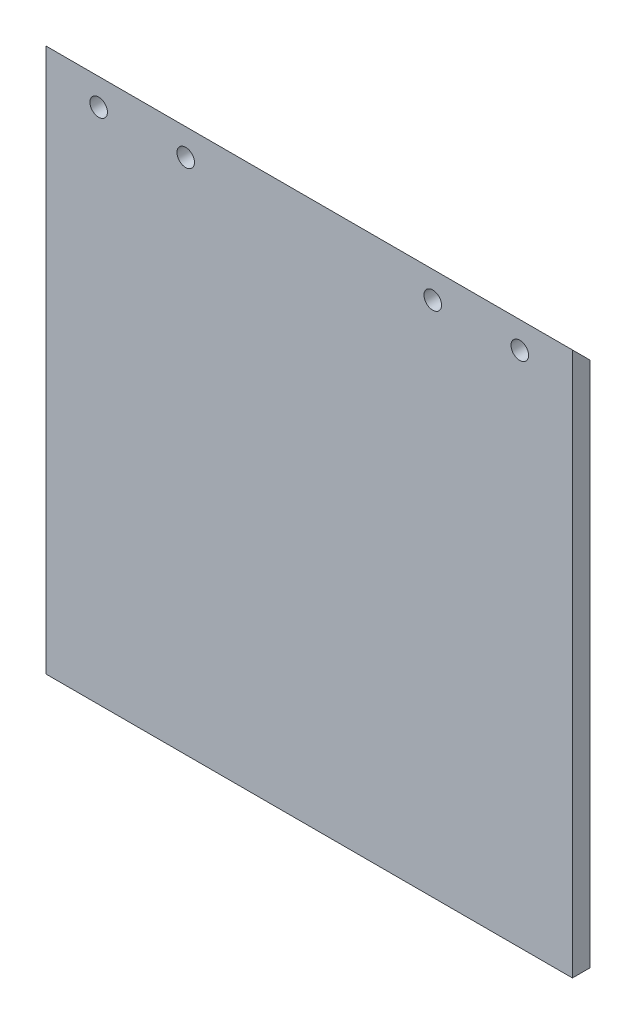
ISO-10303-21;
HEADER;
FILE_DESCRIPTION(('STEP AP214'),'2;1');
FILE_NAME('part.step','',(''),(''),'','','');
FILE_SCHEMA(('AUTOMOTIVE_DESIGN { 1 0 10303 214 1 1 1 1 }'));
ENDSEC;
DATA;
#1=APPLICATION_CONTEXT('core data for automotive mechanical design processes');
#2=APPLICATION_PROTOCOL_DEFINITION('international standard','automotive_design',2000,#1);
#3=PRODUCT_CONTEXT('',#1,'mechanical');
#4=PRODUCT('Part','Part','',(#3));
#5=PRODUCT_RELATED_PRODUCT_CATEGORY('part','',(#4));
#6=PRODUCT_DEFINITION_FORMATION('','',#4);
#7=PRODUCT_DEFINITION_CONTEXT('part definition',#1,'design');
#8=PRODUCT_DEFINITION('design','',#6,#7);
#9=PRODUCT_DEFINITION_SHAPE('','',#8);
#10=(LENGTH_UNIT() NAMED_UNIT(*) SI_UNIT(.MILLI.,.METRE.));
#11=(NAMED_UNIT(*) PLANE_ANGLE_UNIT() SI_UNIT($,.RADIAN.));
#12=(NAMED_UNIT(*) SI_UNIT($,.STERADIAN.) SOLID_ANGLE_UNIT());
#13=UNCERTAINTY_MEASURE_WITH_UNIT(LENGTH_MEASURE(1.E-05),#10,'distance_accuracy_value','');
#14=(GEOMETRIC_REPRESENTATION_CONTEXT(3) GLOBAL_UNCERTAINTY_ASSIGNED_CONTEXT((#13)) GLOBAL_UNIT_ASSIGNED_CONTEXT((#10,
#11,#12)) REPRESENTATION_CONTEXT('',''));
#15=CARTESIAN_POINT('',(0.,0.,0.));
#16=DIRECTION('',(0.,0.,1.));
#17=DIRECTION('',(1.,0.,0.));
#18=AXIS2_PLACEMENT_3D('',#15,#16,#17);
#19=CARTESIAN_POINT('',(0.,0.,3.175));
#20=DIRECTION('',(0.,-1.,0.));
#21=DIRECTION('',(0.,0.,-1.));
#22=AXIS2_PLACEMENT_3D('',#19,#20,#21);
#23=PLANE('',#22);
#24=DIRECTION('',(-1.,0.,0.));
#25=VECTOR('',#24,1.);
#26=CARTESIAN_POINT('',(0.,0.,0.));
#27=LINE('',#26,#25);
#28=CARTESIAN_POINT('',(0.,0.,0.));
#29=VERTEX_POINT('',#28);
#30=CARTESIAN_POINT('',(-95.25,0.,0.));
#31=VERTEX_POINT('',#30);
#32=EDGE_CURVE('E114',#29,#31,#27,.T.);
#33=ORIENTED_EDGE('',*,*,#32,.F.);
#34=DIRECTION('',(0.,0.,-1.));
#35=VECTOR('',#34,1.);
#36=CARTESIAN_POINT('',(0.,0.,3.175));
#37=LINE('',#36,#35);
#38=CARTESIAN_POINT('',(0.,0.,3.175));
#39=VERTEX_POINT('',#38);
#40=EDGE_CURVE('E93',#39,#29,#37,.T.);
#41=ORIENTED_EDGE('',*,*,#40,.F.);
#42=DIRECTION('',(-1.,0.,0.));
#43=VECTOR('',#42,1.);
#44=CARTESIAN_POINT('',(0.,0.,3.175));
#45=LINE('',#44,#43);
#46=CARTESIAN_POINT('',(-95.25,0.,3.175));
#47=VERTEX_POINT('',#46);
#48=EDGE_CURVE('E97',#39,#47,#45,.T.);
#49=ORIENTED_EDGE('',*,*,#48,.T.);
#50=DIRECTION('',(0.,0.,-1.));
#51=VECTOR('',#50,1.);
#52=CARTESIAN_POINT('',(-95.25,0.,3.175));
#53=LINE('',#52,#51);
#54=EDGE_CURVE('E82',#47,#31,#53,.T.);
#55=ORIENTED_EDGE('',*,*,#54,.T.);
#56=EDGE_LOOP('',(#33,#41,#49,#55));
#57=FACE_BOUND('',#56,.T.);
#58=ADVANCED_FACE('F41',(#57),#23,.T.);
#59=CARTESIAN_POINT('',(0.,0.,3.175));
#60=DIRECTION('',(-1.,0.,0.));
#61=DIRECTION('',(0.,-1.,0.));
#62=AXIS2_PLACEMENT_3D('',#59,#60,#61);
#63=PLANE('',#62);
#64=DIRECTION('',(0.,1.,0.));
#65=VECTOR('',#64,1.);
#66=CARTESIAN_POINT('',(0.,0.,0.));
#67=LINE('',#66,#65);
#68=CARTESIAN_POINT('',(0.,95.25,0.));
#69=VERTEX_POINT('',#68);
#70=EDGE_CURVE('E102',#29,#69,#67,.T.);
#71=ORIENTED_EDGE('',*,*,#70,.T.);
#72=DIRECTION('',(0.,0.707106781186549,0.707106781186546));
#73=VECTOR('',#72,1.);
#74=CARTESIAN_POINT('',(0.,98.425,3.17499999999998));
#75=LINE('',#74,#73);
#76=CARTESIAN_POINT('',(0.,98.425,3.175));
#77=VERTEX_POINT('',#76);
#78=EDGE_CURVE('E11',#69,#77,#75,.T.);
#79=ORIENTED_EDGE('',*,*,#78,.T.);
#80=DIRECTION('',(0.,1.,0.));
#81=VECTOR('',#80,1.);
#82=CARTESIAN_POINT('',(0.,0.,3.175));
#83=LINE('',#82,#81);
#84=EDGE_CURVE('E95',#39,#77,#83,.T.);
#85=ORIENTED_EDGE('',*,*,#84,.F.);
#86=ORIENTED_EDGE('',*,*,#40,.T.);
#87=EDGE_LOOP('',(#71,#79,#85,#86));
#88=FACE_BOUND('',#87,.T.);
#89=ADVANCED_FACE('F148',(#88),#63,.F.);
#90=CARTESIAN_POINT('',(-95.25,0.,3.175));
#91=DIRECTION('',(-1.,0.,0.));
#92=DIRECTION('',(0.,0.,1.));
#93=AXIS2_PLACEMENT_3D('',#90,#91,#92);
#94=PLANE('',#93);
#95=DIRECTION('',(0.,1.,0.));
#96=VECTOR('',#95,1.);
#97=CARTESIAN_POINT('',(-95.25,0.,3.175));
#98=LINE('',#97,#96);
#99=CARTESIAN_POINT('',(-95.25,98.425,3.175));
#100=VERTEX_POINT('',#99);
#101=EDGE_CURVE('E85',#47,#100,#98,.T.);
#102=ORIENTED_EDGE('',*,*,#101,.T.);
#103=DIRECTION('',(0.,-0.707106781186549,-0.707106781186546));
#104=VECTOR('',#103,1.);
#105=CARTESIAN_POINT('',(-95.25,49.2124999999998,-46.0375));
#106=LINE('',#105,#104);
#107=CARTESIAN_POINT('',(-95.25,95.25,0.));
#108=VERTEX_POINT('',#107);
#109=EDGE_CURVE('E66',#100,#108,#106,.T.);
#110=ORIENTED_EDGE('',*,*,#109,.T.);
#111=DIRECTION('',(0.,1.,0.));
#112=VECTOR('',#111,1.);
#113=CARTESIAN_POINT('',(-95.25,0.,0.));
#114=LINE('',#113,#112);
#115=EDGE_CURVE('E88',#31,#108,#114,.T.);
#116=ORIENTED_EDGE('',*,*,#115,.F.);
#117=ORIENTED_EDGE('',*,*,#54,.F.);
#118=EDGE_LOOP('',(#102,#110,#116,#117));
#119=FACE_BOUND('',#118,.T.);
#120=ADVANCED_FACE('F83',(#119),#94,.T.);
#121=CARTESIAN_POINT('',(0.,0.,3.175));
#122=DIRECTION('',(0.,0.,-1.));
#123=DIRECTION('',(-1.,0.,0.));
#124=AXIS2_PLACEMENT_3D('',#121,#122,#123);
#125=PLANE('',#124);
#126=CARTESIAN_POINT('',(-85.725,93.599,3.175));
#127=DIRECTION('',(0.,0.,1.));
#128=DIRECTION('',(1.,0.,0.));
#129=AXIS2_PLACEMENT_3D('',#126,#127,#128);
#130=CIRCLE('',#129,1.5875);
#131=CARTESIAN_POINT('',(-84.1375,93.599,3.175));
#132=VERTEX_POINT('',#131);
#133=EDGE_CURVE('E124',#132,#132,#130,.T.);
#134=ORIENTED_EDGE('',*,*,#133,.F.);
#135=EDGE_LOOP('',(#134));
#136=FACE_BOUND('',#135,.T.);
#137=CARTESIAN_POINT('',(-69.977,93.599,3.175));
#138=DIRECTION('',(0.,0.,1.));
#139=DIRECTION('',(1.,0.,0.));
#140=AXIS2_PLACEMENT_3D('',#137,#138,#139);
#141=CIRCLE('',#140,1.5875);
#142=CARTESIAN_POINT('',(-68.3895,93.599,3.175));
#143=VERTEX_POINT('',#142);
#144=EDGE_CURVE('E232',#143,#143,#141,.T.);
#145=ORIENTED_EDGE('',*,*,#144,.F.);
#146=EDGE_LOOP('',(#145));
#147=FACE_BOUND('',#146,.T.);
#148=CARTESIAN_POINT('',(-25.273,93.599,3.175));
#149=DIRECTION('',(0.,0.,1.));
#150=DIRECTION('',(1.,0.,0.));
#151=AXIS2_PLACEMENT_3D('',#148,#149,#150);
#152=CIRCLE('',#151,1.5875);
#153=CARTESIAN_POINT('',(-23.6855,93.599,3.175));
#154=VERTEX_POINT('',#153);
#155=EDGE_CURVE('E233',#154,#154,#152,.T.);
#156=ORIENTED_EDGE('',*,*,#155,.F.);
#157=EDGE_LOOP('',(#156));
#158=FACE_BOUND('',#157,.T.);
#159=CARTESIAN_POINT('',(-9.525,93.599,3.175));
#160=DIRECTION('',(0.,0.,1.));
#161=DIRECTION('',(1.,0.,0.));
#162=AXIS2_PLACEMENT_3D('',#159,#160,#161);
#163=CIRCLE('',#162,1.5875);
#164=CARTESIAN_POINT('',(-7.9375,93.599,3.175));
#165=VERTEX_POINT('',#164);
#166=EDGE_CURVE('E107',#165,#165,#163,.T.);
#167=ORIENTED_EDGE('',*,*,#166,.F.);
#168=EDGE_LOOP('',(#167));
#169=FACE_BOUND('',#168,.T.);
#170=ORIENTED_EDGE('',*,*,#48,.F.);
#171=ORIENTED_EDGE('',*,*,#84,.T.);
#172=DIRECTION('',(-1.,0.,0.));
#173=VECTOR('',#172,1.);
#174=CARTESIAN_POINT('',(0.,98.425,3.175));
#175=LINE('',#174,#173);
#176=EDGE_CURVE('E101',#77,#100,#175,.T.);
#177=ORIENTED_EDGE('',*,*,#176,.T.);
#178=ORIENTED_EDGE('',*,*,#101,.F.);
#179=EDGE_LOOP('',(#170,#171,#177,#178));
#180=FACE_BOUND('',#179,.T.);
#181=ADVANCED_FACE('F100',(#136,#147,#158,#169,#180),#125,.F.);
#182=CARTESIAN_POINT('',(0.,0.,0.));
#183=DIRECTION('',(0.,0.,-1.));
#184=DIRECTION('',(-1.,0.,0.));
#185=AXIS2_PLACEMENT_3D('',#182,#183,#184);
#186=PLANE('',#185);
#187=CARTESIAN_POINT('',(-85.725,93.599,0.));
#188=DIRECTION('',(0.,0.,-1.));
#189=DIRECTION('',(-1.,0.,0.));
#190=AXIS2_PLACEMENT_3D('',#187,#188,#189);
#191=CIRCLE('',#190,1.5875);
#192=CARTESIAN_POINT('',(-84.1375,93.599,0.));
#193=VERTEX_POINT('',#192);
#194=EDGE_CURVE('E46',#193,#193,#191,.T.);
#195=ORIENTED_EDGE('',*,*,#194,.F.);
#196=EDGE_LOOP('',(#195));
#197=FACE_BOUND('',#196,.T.);
#198=CARTESIAN_POINT('',(-69.977,93.599,0.));
#199=DIRECTION('',(0.,0.,-1.));
#200=DIRECTION('',(-1.,0.,0.));
#201=AXIS2_PLACEMENT_3D('',#198,#199,#200);
#202=CIRCLE('',#201,1.5875);
#203=CARTESIAN_POINT('',(-68.3895,93.599,0.));
#204=VERTEX_POINT('',#203);
#205=EDGE_CURVE('E125',#204,#204,#202,.T.);
#206=ORIENTED_EDGE('',*,*,#205,.F.);
#207=EDGE_LOOP('',(#206));
#208=FACE_BOUND('',#207,.T.);
#209=CARTESIAN_POINT('',(-25.273,93.599,0.));
#210=DIRECTION('',(0.,0.,-1.));
#211=DIRECTION('',(-1.,0.,0.));
#212=AXIS2_PLACEMENT_3D('',#209,#210,#211);
#213=CIRCLE('',#212,1.5875);
#214=CARTESIAN_POINT('',(-23.6855,93.599,0.));
#215=VERTEX_POINT('',#214);
#216=EDGE_CURVE('E122',#215,#215,#213,.T.);
#217=ORIENTED_EDGE('',*,*,#216,.F.);
#218=EDGE_LOOP('',(#217));
#219=FACE_BOUND('',#218,.T.);
#220=CARTESIAN_POINT('',(-9.525,93.599,0.));
#221=DIRECTION('',(0.,0.,-1.));
#222=DIRECTION('',(-1.,0.,0.));
#223=AXIS2_PLACEMENT_3D('',#220,#221,#222);
#224=CIRCLE('',#223,1.5875);
#225=CARTESIAN_POINT('',(-7.9375,93.599,0.));
#226=VERTEX_POINT('',#225);
#227=EDGE_CURVE('E116',#226,#226,#224,.T.);
#228=ORIENTED_EDGE('',*,*,#227,.F.);
#229=EDGE_LOOP('',(#228));
#230=FACE_BOUND('',#229,.T.);
#231=ORIENTED_EDGE('',*,*,#115,.T.);
#232=DIRECTION('',(1.,0.,0.));
#233=VECTOR('',#232,1.);
#234=CARTESIAN_POINT('',(0.,95.25,0.));
#235=LINE('',#234,#233);
#236=EDGE_CURVE('E51',#108,#69,#235,.T.);
#237=ORIENTED_EDGE('',*,*,#236,.T.);
#238=ORIENTED_EDGE('',*,*,#70,.F.);
#239=ORIENTED_EDGE('',*,*,#32,.T.);
#240=EDGE_LOOP('',(#231,#237,#238,#239));
#241=FACE_BOUND('',#240,.T.);
#242=ADVANCED_FACE('F133',(#197,#208,#219,#230,#241),#186,.T.);
#243=CARTESIAN_POINT('',(0.,98.425,3.17499999999998));
#244=DIRECTION('',(0.,0.707106781186546,-0.707106781186549));
#245=DIRECTION('',(1.,0.,0.));
#246=AXIS2_PLACEMENT_3D('',#243,#244,#245);
#247=PLANE('',#246);
#248=ORIENTED_EDGE('',*,*,#78,.F.);
#249=ORIENTED_EDGE('',*,*,#236,.F.);
#250=ORIENTED_EDGE('',*,*,#109,.F.);
#251=ORIENTED_EDGE('',*,*,#176,.F.);
#252=EDGE_LOOP('',(#248,#249,#250,#251));
#253=FACE_BOUND('',#252,.T.);
#254=ADVANCED_FACE('F42',(#253),#247,.T.);
#255=CARTESIAN_POINT('',(-9.525,93.599,-14.605));
#256=DIRECTION('',(0.,0.,1.));
#257=DIRECTION('',(1.,0.,0.));
#258=AXIS2_PLACEMENT_3D('',#255,#256,#257);
#259=CYLINDRICAL_SURFACE('',#258,1.5875);
#260=CARTESIAN_POINT('',(-7.9375,93.599,0.));
#261=CARTESIAN_POINT('',(-7.9375,93.599,0.0330729166666682));
#262=CARTESIAN_POINT('',(-7.9375,93.599,0.0661458333333347));
#263=CARTESIAN_POINT('',(-7.9375,93.599,0.132291666666668));
#264=CARTESIAN_POINT('',(-7.9375,93.599,0.165364583333335));
#265=CARTESIAN_POINT('',(-7.9375,93.599,0.231510416666669));
#266=CARTESIAN_POINT('',(-7.9375,93.599,0.264583333333335));
#267=CARTESIAN_POINT('',(-7.9375,93.599,0.330729166666668));
#268=CARTESIAN_POINT('',(-7.9375,93.599,0.363802083333335));
#269=CARTESIAN_POINT('',(-7.9375,93.599,0.429947916666668));
#270=CARTESIAN_POINT('',(-7.9375,93.599,0.463020833333336));
#271=CARTESIAN_POINT('',(-7.9375,93.599,0.529166666666669));
#272=CARTESIAN_POINT('',(-7.9375,93.599,0.562239583333336));
#273=CARTESIAN_POINT('',(-7.9375,93.599,0.628385416666669));
#274=CARTESIAN_POINT('',(-7.9375,93.599,0.661458333333335));
#275=CARTESIAN_POINT('',(-7.9375,93.599,0.727604166666668));
#276=CARTESIAN_POINT('',(-7.9375,93.599,0.760677083333335));
#277=CARTESIAN_POINT('',(-7.9375,93.599,0.826822916666668));
#278=CARTESIAN_POINT('',(-7.9375,93.599,0.859895833333335));
#279=CARTESIAN_POINT('',(-7.9375,93.599,0.926041666666669));
#280=CARTESIAN_POINT('',(-7.9375,93.599,0.959114583333335));
#281=CARTESIAN_POINT('',(-7.9375,93.599,1.02526041666667));
#282=CARTESIAN_POINT('',(-7.9375,93.599,1.05833333333333));
#283=CARTESIAN_POINT('',(-7.9375,93.599,1.12447916666667));
#284=CARTESIAN_POINT('',(-7.9375,93.599,1.15755208333333));
#285=CARTESIAN_POINT('',(-7.9375,93.599,1.22369791666667));
#286=CARTESIAN_POINT('',(-7.9375,93.599,1.25677083333333));
#287=CARTESIAN_POINT('',(-7.9375,93.599,1.32291666666667));
#288=CARTESIAN_POINT('',(-7.9375,93.599,1.35598958333333));
#289=CARTESIAN_POINT('',(-7.9375,93.599,1.42213541666667));
#290=CARTESIAN_POINT('',(-7.9375,93.599,1.45520833333333));
#291=CARTESIAN_POINT('',(-7.9375,93.599,1.52135416666667));
#292=CARTESIAN_POINT('',(-7.9375,93.599,1.55442708333333));
#293=CARTESIAN_POINT('',(-7.9375,93.599,1.62057291666667));
#294=CARTESIAN_POINT('',(-7.9375,93.599,1.65364583333333));
#295=CARTESIAN_POINT('',(-7.9375,93.599,1.71979166666667));
#296=CARTESIAN_POINT('',(-7.9375,93.599,1.75286458333333));
#297=CARTESIAN_POINT('',(-7.9375,93.599,1.81901041666667));
#298=CARTESIAN_POINT('',(-7.9375,93.599,1.85208333333334));
#299=CARTESIAN_POINT('',(-7.9375,93.599,1.91822916666667));
#300=CARTESIAN_POINT('',(-7.9375,93.599,1.95130208333333));
#301=CARTESIAN_POINT('',(-7.9375,93.599,2.01744791666667));
#302=CARTESIAN_POINT('',(-7.9375,93.599,2.05052083333333));
#303=CARTESIAN_POINT('',(-7.9375,93.599,2.11666666666667));
#304=CARTESIAN_POINT('',(-7.9375,93.599,2.14973958333334));
#305=CARTESIAN_POINT('',(-7.9375,93.599,2.21588541666667));
#306=CARTESIAN_POINT('',(-7.9375,93.599,2.24895833333333));
#307=CARTESIAN_POINT('',(-7.9375,93.599,2.31510416666667));
#308=CARTESIAN_POINT('',(-7.9375,93.599,2.34817708333333));
#309=CARTESIAN_POINT('',(-7.9375,93.599,2.41432291666667));
#310=CARTESIAN_POINT('',(-7.9375,93.599,2.44739583333333));
#311=CARTESIAN_POINT('',(-7.9375,93.599,2.51354166666667));
#312=CARTESIAN_POINT('',(-7.9375,93.599,2.54661458333333));
#313=CARTESIAN_POINT('',(-7.9375,93.599,2.61276041666667));
#314=CARTESIAN_POINT('',(-7.9375,93.599,2.64583333333333));
#315=CARTESIAN_POINT('',(-7.9375,93.599,2.71197916666667));
#316=CARTESIAN_POINT('',(-7.9375,93.599,2.74505208333333));
#317=CARTESIAN_POINT('',(-7.9375,93.599,2.81119791666667));
#318=CARTESIAN_POINT('',(-7.9375,93.599,2.84427083333333));
#319=CARTESIAN_POINT('',(-7.9375,93.599,2.91041666666667));
#320=CARTESIAN_POINT('',(-7.9375,93.599,2.94348958333333));
#321=CARTESIAN_POINT('',(-7.9375,93.599,3.00963541666667));
#322=CARTESIAN_POINT('',(-7.9375,93.599,3.04270833333333));
#323=CARTESIAN_POINT('',(-7.9375,93.599,3.10885416666667));
#324=CARTESIAN_POINT('',(-7.9375,93.599,3.14192708333333));
#325=CARTESIAN_POINT('',(-7.9375,93.599,3.175));
#326=B_SPLINE_CURVE_WITH_KNOTS('',3,(#260,#261,#262,#263,#264,#265,#266,#267,#268,#269,#270,
#271,#272,#273,#274,#275,#276,#277,#278,#279,#280,#281,#282,#283,#284,#285,#286,#287,#288,#289,
#290,#291,#292,#293,#294,#295,#296,#297,#298,#299,#300,#301,#302,#303,#304,#305,#306,#307,#308,
#309,#310,#311,#312,#313,#314,#315,#316,#317,#318,#319,#320,#321,#322,#323,#324,#325),
.UNSPECIFIED.,.F.,.F.,(4,2,2,2,2,2,2,2,2,2,2,2,2,2,2,2,2,2,2,2,2,2,2,2,2,2,2,2,2,2,2,2,4),(0.,
0.0992187499999995,0.198437500000001,0.29765625,0.396875,0.496093750000001,0.5953125,0.69453125,
0.793749999999999,0.892968750000001,0.9921875,1.09140625,1.190625,1.28984375,1.3890625,
1.48828125,1.5875,1.68671875,1.7859375,1.88515625,1.984375,2.08359375,2.1828125,2.28203125,
2.38125,2.48046875,2.5796875,2.67890625,2.778125,2.87734375,2.9765625,3.07578125,3.175),.UNSPECIFIED.);
#327=EDGE_CURVE('BSEAM158',#226,#165,#326,.T.);
#328=ORIENTED_EDGE('',*,*,#227,.T.);
#329=ORIENTED_EDGE('',*,*,#166,.T.);
#330=ORIENTED_EDGE('',*,*,#327,.T.);
#331=ORIENTED_EDGE('',*,*,#327,.F.);
#332=EDGE_LOOP('',(#328,#330,#329,#331));
#333=FACE_BOUND('',#332,.T.);
#334=ADVANCED_FACE('F158',(#333),#259,.F.);
#335=CARTESIAN_POINT('',(-25.273,93.599,-14.605));
#336=DIRECTION('',(0.,0.,1.));
#337=DIRECTION('',(1.,0.,0.));
#338=AXIS2_PLACEMENT_3D('',#335,#336,#337);
#339=CYLINDRICAL_SURFACE('',#338,1.5875);
#340=CARTESIAN_POINT('',(-23.6855,93.599,0.));
#341=CARTESIAN_POINT('',(-23.6855,93.599,0.0330729166666682));
#342=CARTESIAN_POINT('',(-23.6855,93.599,0.0661458333333347));
#343=CARTESIAN_POINT('',(-23.6855,93.599,0.132291666666668));
#344=CARTESIAN_POINT('',(-23.6855,93.599,0.165364583333335));
#345=CARTESIAN_POINT('',(-23.6855,93.599,0.231510416666669));
#346=CARTESIAN_POINT('',(-23.6855,93.599,0.264583333333335));
#347=CARTESIAN_POINT('',(-23.6855,93.599,0.330729166666668));
#348=CARTESIAN_POINT('',(-23.6855,93.599,0.363802083333335));
#349=CARTESIAN_POINT('',(-23.6855,93.599,0.429947916666668));
#350=CARTESIAN_POINT('',(-23.6855,93.599,0.463020833333336));
#351=CARTESIAN_POINT('',(-23.6855,93.599,0.529166666666669));
#352=CARTESIAN_POINT('',(-23.6855,93.599,0.562239583333336));
#353=CARTESIAN_POINT('',(-23.6855,93.599,0.628385416666669));
#354=CARTESIAN_POINT('',(-23.6855,93.599,0.661458333333335));
#355=CARTESIAN_POINT('',(-23.6855,93.599,0.727604166666668));
#356=CARTESIAN_POINT('',(-23.6855,93.599,0.760677083333335));
#357=CARTESIAN_POINT('',(-23.6855,93.599,0.826822916666668));
#358=CARTESIAN_POINT('',(-23.6855,93.599,0.859895833333335));
#359=CARTESIAN_POINT('',(-23.6855,93.599,0.926041666666669));
#360=CARTESIAN_POINT('',(-23.6855,93.599,0.959114583333335));
#361=CARTESIAN_POINT('',(-23.6855,93.599,1.02526041666667));
#362=CARTESIAN_POINT('',(-23.6855,93.599,1.05833333333333));
#363=CARTESIAN_POINT('',(-23.6855,93.599,1.12447916666667));
#364=CARTESIAN_POINT('',(-23.6855,93.599,1.15755208333333));
#365=CARTESIAN_POINT('',(-23.6855,93.599,1.22369791666667));
#366=CARTESIAN_POINT('',(-23.6855,93.599,1.25677083333333));
#367=CARTESIAN_POINT('',(-23.6855,93.599,1.32291666666667));
#368=CARTESIAN_POINT('',(-23.6855,93.599,1.35598958333333));
#369=CARTESIAN_POINT('',(-23.6855,93.599,1.42213541666667));
#370=CARTESIAN_POINT('',(-23.6855,93.599,1.45520833333333));
#371=CARTESIAN_POINT('',(-23.6855,93.599,1.52135416666667));
#372=CARTESIAN_POINT('',(-23.6855,93.599,1.55442708333333));
#373=CARTESIAN_POINT('',(-23.6855,93.599,1.62057291666667));
#374=CARTESIAN_POINT('',(-23.6855,93.599,1.65364583333333));
#375=CARTESIAN_POINT('',(-23.6855,93.599,1.71979166666667));
#376=CARTESIAN_POINT('',(-23.6855,93.599,1.75286458333333));
#377=CARTESIAN_POINT('',(-23.6855,93.599,1.81901041666667));
#378=CARTESIAN_POINT('',(-23.6855,93.599,1.85208333333334));
#379=CARTESIAN_POINT('',(-23.6855,93.599,1.91822916666667));
#380=CARTESIAN_POINT('',(-23.6855,93.599,1.95130208333333));
#381=CARTESIAN_POINT('',(-23.6855,93.599,2.01744791666667));
#382=CARTESIAN_POINT('',(-23.6855,93.599,2.05052083333333));
#383=CARTESIAN_POINT('',(-23.6855,93.599,2.11666666666667));
#384=CARTESIAN_POINT('',(-23.6855,93.599,2.14973958333334));
#385=CARTESIAN_POINT('',(-23.6855,93.599,2.21588541666667));
#386=CARTESIAN_POINT('',(-23.6855,93.599,2.24895833333333));
#387=CARTESIAN_POINT('',(-23.6855,93.599,2.31510416666667));
#388=CARTESIAN_POINT('',(-23.6855,93.599,2.34817708333333));
#389=CARTESIAN_POINT('',(-23.6855,93.599,2.41432291666667));
#390=CARTESIAN_POINT('',(-23.6855,93.599,2.44739583333333));
#391=CARTESIAN_POINT('',(-23.6855,93.599,2.51354166666667));
#392=CARTESIAN_POINT('',(-23.6855,93.599,2.54661458333333));
#393=CARTESIAN_POINT('',(-23.6855,93.599,2.61276041666667));
#394=CARTESIAN_POINT('',(-23.6855,93.599,2.64583333333333));
#395=CARTESIAN_POINT('',(-23.6855,93.599,2.71197916666667));
#396=CARTESIAN_POINT('',(-23.6855,93.599,2.74505208333333));
#397=CARTESIAN_POINT('',(-23.6855,93.599,2.81119791666667));
#398=CARTESIAN_POINT('',(-23.6855,93.599,2.84427083333333));
#399=CARTESIAN_POINT('',(-23.6855,93.599,2.91041666666667));
#400=CARTESIAN_POINT('',(-23.6855,93.599,2.94348958333333));
#401=CARTESIAN_POINT('',(-23.6855,93.599,3.00963541666667));
#402=CARTESIAN_POINT('',(-23.6855,93.599,3.04270833333333));
#403=CARTESIAN_POINT('',(-23.6855,93.599,3.10885416666667));
#404=CARTESIAN_POINT('',(-23.6855,93.599,3.14192708333333));
#405=CARTESIAN_POINT('',(-23.6855,93.599,3.175));
#406=B_SPLINE_CURVE_WITH_KNOTS('',3,(#340,#341,#342,#343,#344,#345,#346,#347,#348,#349,#350,
#351,#352,#353,#354,#355,#356,#357,#358,#359,#360,#361,#362,#363,#364,#365,#366,#367,#368,#369,
#370,#371,#372,#373,#374,#375,#376,#377,#378,#379,#380,#381,#382,#383,#384,#385,#386,#387,#388,
#389,#390,#391,#392,#393,#394,#395,#396,#397,#398,#399,#400,#401,#402,#403,#404,#405),
.UNSPECIFIED.,.F.,.F.,(4,2,2,2,2,2,2,2,2,2,2,2,2,2,2,2,2,2,2,2,2,2,2,2,2,2,2,2,2,2,2,2,4),(0.,
0.0992187499999995,0.198437500000001,0.29765625,0.396875,0.496093750000001,0.5953125,0.69453125,
0.793749999999999,0.892968750000001,0.9921875,1.09140625,1.190625,1.28984375,1.3890625,
1.48828125,1.5875,1.68671875,1.7859375,1.88515625,1.984375,2.08359375,2.1828125,2.28203125,
2.38125,2.48046875,2.5796875,2.67890625,2.778125,2.87734375,2.9765625,3.07578125,3.175),.UNSPECIFIED.);
#407=EDGE_CURVE('BSEAM161',#215,#154,#406,.T.);
#408=ORIENTED_EDGE('',*,*,#216,.T.);
#409=ORIENTED_EDGE('',*,*,#155,.T.);
#410=ORIENTED_EDGE('',*,*,#407,.T.);
#411=ORIENTED_EDGE('',*,*,#407,.F.);
#412=EDGE_LOOP('',(#408,#410,#409,#411));
#413=FACE_BOUND('',#412,.T.);
#414=ADVANCED_FACE('F161',(#413),#339,.F.);
#415=CARTESIAN_POINT('',(-69.977,93.599,-14.605));
#416=DIRECTION('',(0.,0.,1.));
#417=DIRECTION('',(1.,0.,0.));
#418=AXIS2_PLACEMENT_3D('',#415,#416,#417);
#419=CYLINDRICAL_SURFACE('',#418,1.5875);
#420=CARTESIAN_POINT('',(-68.3895,93.599,0.));
#421=CARTESIAN_POINT('',(-68.3895,93.599,0.0330729166666682));
#422=CARTESIAN_POINT('',(-68.3895,93.599,0.0661458333333347));
#423=CARTESIAN_POINT('',(-68.3895,93.599,0.132291666666668));
#424=CARTESIAN_POINT('',(-68.3895,93.599,0.165364583333335));
#425=CARTESIAN_POINT('',(-68.3895,93.599,0.231510416666669));
#426=CARTESIAN_POINT('',(-68.3895,93.599,0.264583333333335));
#427=CARTESIAN_POINT('',(-68.3895,93.599,0.330729166666668));
#428=CARTESIAN_POINT('',(-68.3895,93.599,0.363802083333335));
#429=CARTESIAN_POINT('',(-68.3895,93.599,0.429947916666668));
#430=CARTESIAN_POINT('',(-68.3895,93.599,0.463020833333336));
#431=CARTESIAN_POINT('',(-68.3895,93.599,0.529166666666669));
#432=CARTESIAN_POINT('',(-68.3895,93.599,0.562239583333336));
#433=CARTESIAN_POINT('',(-68.3895,93.599,0.628385416666669));
#434=CARTESIAN_POINT('',(-68.3895,93.599,0.661458333333335));
#435=CARTESIAN_POINT('',(-68.3895,93.599,0.727604166666668));
#436=CARTESIAN_POINT('',(-68.3895,93.599,0.760677083333335));
#437=CARTESIAN_POINT('',(-68.3895,93.599,0.826822916666668));
#438=CARTESIAN_POINT('',(-68.3895,93.599,0.859895833333335));
#439=CARTESIAN_POINT('',(-68.3895,93.599,0.926041666666669));
#440=CARTESIAN_POINT('',(-68.3895,93.599,0.959114583333335));
#441=CARTESIAN_POINT('',(-68.3895,93.599,1.02526041666667));
#442=CARTESIAN_POINT('',(-68.3895,93.599,1.05833333333333));
#443=CARTESIAN_POINT('',(-68.3895,93.599,1.12447916666667));
#444=CARTESIAN_POINT('',(-68.3895,93.599,1.15755208333333));
#445=CARTESIAN_POINT('',(-68.3895,93.599,1.22369791666667));
#446=CARTESIAN_POINT('',(-68.3895,93.599,1.25677083333333));
#447=CARTESIAN_POINT('',(-68.3895,93.599,1.32291666666667));
#448=CARTESIAN_POINT('',(-68.3895,93.599,1.35598958333333));
#449=CARTESIAN_POINT('',(-68.3895,93.599,1.42213541666667));
#450=CARTESIAN_POINT('',(-68.3895,93.599,1.45520833333333));
#451=CARTESIAN_POINT('',(-68.3895,93.599,1.52135416666667));
#452=CARTESIAN_POINT('',(-68.3895,93.599,1.55442708333333));
#453=CARTESIAN_POINT('',(-68.3895,93.599,1.62057291666667));
#454=CARTESIAN_POINT('',(-68.3895,93.599,1.65364583333333));
#455=CARTESIAN_POINT('',(-68.3895,93.599,1.71979166666667));
#456=CARTESIAN_POINT('',(-68.3895,93.599,1.75286458333333));
#457=CARTESIAN_POINT('',(-68.3895,93.599,1.81901041666667));
#458=CARTESIAN_POINT('',(-68.3895,93.599,1.85208333333334));
#459=CARTESIAN_POINT('',(-68.3895,93.599,1.91822916666667));
#460=CARTESIAN_POINT('',(-68.3895,93.599,1.95130208333333));
#461=CARTESIAN_POINT('',(-68.3895,93.599,2.01744791666667));
#462=CARTESIAN_POINT('',(-68.3895,93.599,2.05052083333333));
#463=CARTESIAN_POINT('',(-68.3895,93.599,2.11666666666667));
#464=CARTESIAN_POINT('',(-68.3895,93.599,2.14973958333334));
#465=CARTESIAN_POINT('',(-68.3895,93.599,2.21588541666667));
#466=CARTESIAN_POINT('',(-68.3895,93.599,2.24895833333333));
#467=CARTESIAN_POINT('',(-68.3895,93.599,2.31510416666667));
#468=CARTESIAN_POINT('',(-68.3895,93.599,2.34817708333333));
#469=CARTESIAN_POINT('',(-68.3895,93.599,2.41432291666667));
#470=CARTESIAN_POINT('',(-68.3895,93.599,2.44739583333333));
#471=CARTESIAN_POINT('',(-68.3895,93.599,2.51354166666667));
#472=CARTESIAN_POINT('',(-68.3895,93.599,2.54661458333333));
#473=CARTESIAN_POINT('',(-68.3895,93.599,2.61276041666667));
#474=CARTESIAN_POINT('',(-68.3895,93.599,2.64583333333333));
#475=CARTESIAN_POINT('',(-68.3895,93.599,2.71197916666667));
#476=CARTESIAN_POINT('',(-68.3895,93.599,2.74505208333333));
#477=CARTESIAN_POINT('',(-68.3895,93.599,2.81119791666667));
#478=CARTESIAN_POINT('',(-68.3895,93.599,2.84427083333333));
#479=CARTESIAN_POINT('',(-68.3895,93.599,2.91041666666667));
#480=CARTESIAN_POINT('',(-68.3895,93.599,2.94348958333333));
#481=CARTESIAN_POINT('',(-68.3895,93.599,3.00963541666667));
#482=CARTESIAN_POINT('',(-68.3895,93.599,3.04270833333333));
#483=CARTESIAN_POINT('',(-68.3895,93.599,3.10885416666667));
#484=CARTESIAN_POINT('',(-68.3895,93.599,3.14192708333333));
#485=CARTESIAN_POINT('',(-68.3895,93.599,3.175));
#486=B_SPLINE_CURVE_WITH_KNOTS('',3,(#420,#421,#422,#423,#424,#425,#426,#427,#428,#429,#430,
#431,#432,#433,#434,#435,#436,#437,#438,#439,#440,#441,#442,#443,#444,#445,#446,#447,#448,#449,
#450,#451,#452,#453,#454,#455,#456,#457,#458,#459,#460,#461,#462,#463,#464,#465,#466,#467,#468,
#469,#470,#471,#472,#473,#474,#475,#476,#477,#478,#479,#480,#481,#482,#483,#484,#485),
.UNSPECIFIED.,.F.,.F.,(4,2,2,2,2,2,2,2,2,2,2,2,2,2,2,2,2,2,2,2,2,2,2,2,2,2,2,2,2,2,2,2,4),(0.,
0.0992187499999995,0.198437500000001,0.29765625,0.396875,0.496093750000001,0.5953125,0.69453125,
0.793749999999999,0.892968750000001,0.9921875,1.09140625,1.190625,1.28984375,1.3890625,
1.48828125,1.5875,1.68671875,1.7859375,1.88515625,1.984375,2.08359375,2.1828125,2.28203125,
2.38125,2.48046875,2.5796875,2.67890625,2.778125,2.87734375,2.9765625,3.07578125,3.175),.UNSPECIFIED.);
#487=EDGE_CURVE('BSEAM164',#204,#143,#486,.T.);
#488=ORIENTED_EDGE('',*,*,#205,.T.);
#489=ORIENTED_EDGE('',*,*,#144,.T.);
#490=ORIENTED_EDGE('',*,*,#487,.T.);
#491=ORIENTED_EDGE('',*,*,#487,.F.);
#492=EDGE_LOOP('',(#488,#490,#489,#491));
#493=FACE_BOUND('',#492,.T.);
#494=ADVANCED_FACE('F164',(#493),#419,.F.);
#495=CARTESIAN_POINT('',(-85.725,93.599,-14.605));
#496=DIRECTION('',(0.,0.,1.));
#497=DIRECTION('',(1.,0.,0.));
#498=AXIS2_PLACEMENT_3D('',#495,#496,#497);
#499=CYLINDRICAL_SURFACE('',#498,1.5875);
#500=CARTESIAN_POINT('',(-84.1375,93.599,0.));
#501=CARTESIAN_POINT('',(-84.1375,93.599,0.0330729166666682));
#502=CARTESIAN_POINT('',(-84.1375,93.599,0.0661458333333347));
#503=CARTESIAN_POINT('',(-84.1375,93.599,0.132291666666668));
#504=CARTESIAN_POINT('',(-84.1375,93.599,0.165364583333335));
#505=CARTESIAN_POINT('',(-84.1375,93.599,0.231510416666669));
#506=CARTESIAN_POINT('',(-84.1375,93.599,0.264583333333335));
#507=CARTESIAN_POINT('',(-84.1375,93.599,0.330729166666668));
#508=CARTESIAN_POINT('',(-84.1375,93.599,0.363802083333335));
#509=CARTESIAN_POINT('',(-84.1375,93.599,0.429947916666668));
#510=CARTESIAN_POINT('',(-84.1375,93.599,0.463020833333336));
#511=CARTESIAN_POINT('',(-84.1375,93.599,0.529166666666669));
#512=CARTESIAN_POINT('',(-84.1375,93.599,0.562239583333336));
#513=CARTESIAN_POINT('',(-84.1375,93.599,0.628385416666669));
#514=CARTESIAN_POINT('',(-84.1375,93.599,0.661458333333335));
#515=CARTESIAN_POINT('',(-84.1375,93.599,0.727604166666668));
#516=CARTESIAN_POINT('',(-84.1375,93.599,0.760677083333335));
#517=CARTESIAN_POINT('',(-84.1375,93.599,0.826822916666668));
#518=CARTESIAN_POINT('',(-84.1375,93.599,0.859895833333335));
#519=CARTESIAN_POINT('',(-84.1375,93.599,0.926041666666669));
#520=CARTESIAN_POINT('',(-84.1375,93.599,0.959114583333335));
#521=CARTESIAN_POINT('',(-84.1375,93.599,1.02526041666667));
#522=CARTESIAN_POINT('',(-84.1375,93.599,1.05833333333333));
#523=CARTESIAN_POINT('',(-84.1375,93.599,1.12447916666667));
#524=CARTESIAN_POINT('',(-84.1375,93.599,1.15755208333333));
#525=CARTESIAN_POINT('',(-84.1375,93.599,1.22369791666667));
#526=CARTESIAN_POINT('',(-84.1375,93.599,1.25677083333333));
#527=CARTESIAN_POINT('',(-84.1375,93.599,1.32291666666667));
#528=CARTESIAN_POINT('',(-84.1375,93.599,1.35598958333333));
#529=CARTESIAN_POINT('',(-84.1375,93.599,1.42213541666667));
#530=CARTESIAN_POINT('',(-84.1375,93.599,1.45520833333333));
#531=CARTESIAN_POINT('',(-84.1375,93.599,1.52135416666667));
#532=CARTESIAN_POINT('',(-84.1375,93.599,1.55442708333333));
#533=CARTESIAN_POINT('',(-84.1375,93.599,1.62057291666667));
#534=CARTESIAN_POINT('',(-84.1375,93.599,1.65364583333333));
#535=CARTESIAN_POINT('',(-84.1375,93.599,1.71979166666667));
#536=CARTESIAN_POINT('',(-84.1375,93.599,1.75286458333333));
#537=CARTESIAN_POINT('',(-84.1375,93.599,1.81901041666667));
#538=CARTESIAN_POINT('',(-84.1375,93.599,1.85208333333334));
#539=CARTESIAN_POINT('',(-84.1375,93.599,1.91822916666667));
#540=CARTESIAN_POINT('',(-84.1375,93.599,1.95130208333333));
#541=CARTESIAN_POINT('',(-84.1375,93.599,2.01744791666667));
#542=CARTESIAN_POINT('',(-84.1375,93.599,2.05052083333333));
#543=CARTESIAN_POINT('',(-84.1375,93.599,2.11666666666667));
#544=CARTESIAN_POINT('',(-84.1375,93.599,2.14973958333334));
#545=CARTESIAN_POINT('',(-84.1375,93.599,2.21588541666667));
#546=CARTESIAN_POINT('',(-84.1375,93.599,2.24895833333333));
#547=CARTESIAN_POINT('',(-84.1375,93.599,2.31510416666667));
#548=CARTESIAN_POINT('',(-84.1375,93.599,2.34817708333333));
#549=CARTESIAN_POINT('',(-84.1375,93.599,2.41432291666667));
#550=CARTESIAN_POINT('',(-84.1375,93.599,2.44739583333333));
#551=CARTESIAN_POINT('',(-84.1375,93.599,2.51354166666667));
#552=CARTESIAN_POINT('',(-84.1375,93.599,2.54661458333333));
#553=CARTESIAN_POINT('',(-84.1375,93.599,2.61276041666667));
#554=CARTESIAN_POINT('',(-84.1375,93.599,2.64583333333333));
#555=CARTESIAN_POINT('',(-84.1375,93.599,2.71197916666667));
#556=CARTESIAN_POINT('',(-84.1375,93.599,2.74505208333333));
#557=CARTESIAN_POINT('',(-84.1375,93.599,2.81119791666667));
#558=CARTESIAN_POINT('',(-84.1375,93.599,2.84427083333333));
#559=CARTESIAN_POINT('',(-84.1375,93.599,2.91041666666667));
#560=CARTESIAN_POINT('',(-84.1375,93.599,2.94348958333333));
#561=CARTESIAN_POINT('',(-84.1375,93.599,3.00963541666667));
#562=CARTESIAN_POINT('',(-84.1375,93.599,3.04270833333333));
#563=CARTESIAN_POINT('',(-84.1375,93.599,3.10885416666667));
#564=CARTESIAN_POINT('',(-84.1375,93.599,3.14192708333333));
#565=CARTESIAN_POINT('',(-84.1375,93.599,3.175));
#566=B_SPLINE_CURVE_WITH_KNOTS('',3,(#500,#501,#502,#503,#504,#505,#506,#507,#508,#509,#510,
#511,#512,#513,#514,#515,#516,#517,#518,#519,#520,#521,#522,#523,#524,#525,#526,#527,#528,#529,
#530,#531,#532,#533,#534,#535,#536,#537,#538,#539,#540,#541,#542,#543,#544,#545,#546,#547,#548,
#549,#550,#551,#552,#553,#554,#555,#556,#557,#558,#559,#560,#561,#562,#563,#564,#565),
.UNSPECIFIED.,.F.,.F.,(4,2,2,2,2,2,2,2,2,2,2,2,2,2,2,2,2,2,2,2,2,2,2,2,2,2,2,2,2,2,2,2,4),(0.,
0.0992187499999995,0.198437500000001,0.29765625,0.396875,0.496093750000001,0.5953125,0.69453125,
0.793749999999999,0.892968750000001,0.9921875,1.09140625,1.190625,1.28984375,1.3890625,
1.48828125,1.5875,1.68671875,1.7859375,1.88515625,1.984375,2.08359375,2.1828125,2.28203125,
2.38125,2.48046875,2.5796875,2.67890625,2.778125,2.87734375,2.9765625,3.07578125,3.175),.UNSPECIFIED.);
#567=EDGE_CURVE('BSEAM135',#193,#132,#566,.T.);
#568=ORIENTED_EDGE('',*,*,#194,.T.);
#569=ORIENTED_EDGE('',*,*,#133,.T.);
#570=ORIENTED_EDGE('',*,*,#567,.T.);
#571=ORIENTED_EDGE('',*,*,#567,.F.);
#572=EDGE_LOOP('',(#568,#570,#569,#571));
#573=FACE_BOUND('',#572,.T.);
#574=ADVANCED_FACE('F135',(#573),#499,.F.);
#575=CLOSED_SHELL('',(#58,#89,#120,#181,#242,#254,#334,#414,#494,#574));
#576=MANIFOLD_SOLID_BREP('B2',#575);
#577=ADVANCED_BREP_SHAPE_REPRESENTATION('',(#18,#576),#14);
#578=SHAPE_DEFINITION_REPRESENTATION(#9,#577);
ENDSEC;
END-ISO-10303-21;
